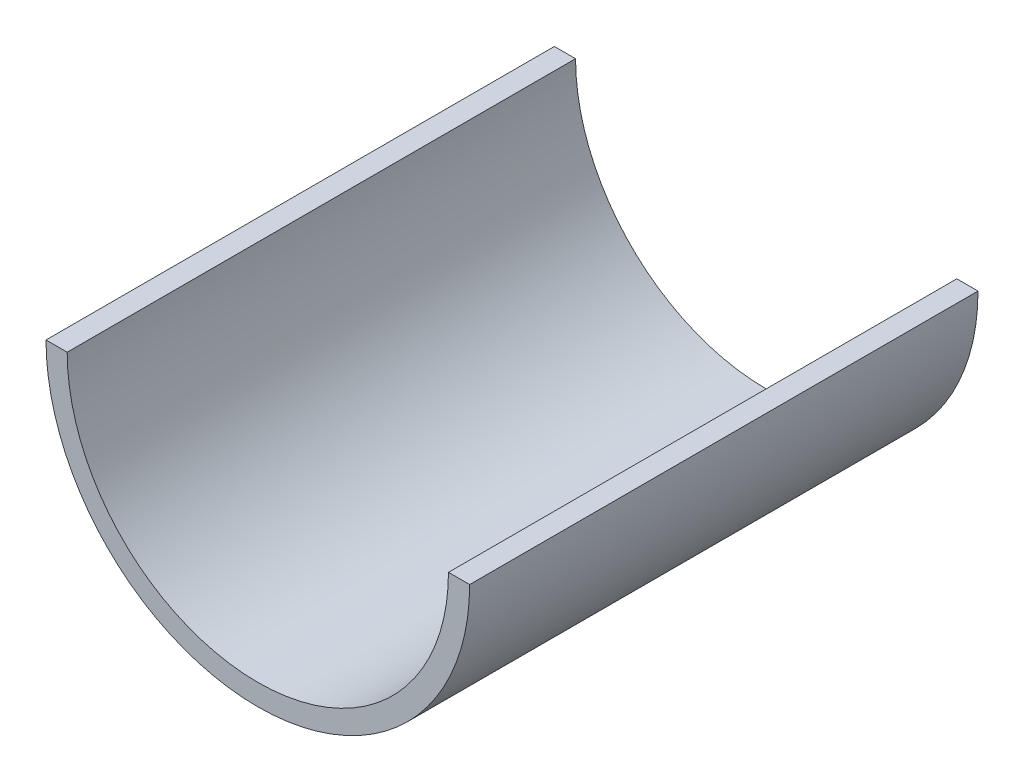
ISO-10303-21;
HEADER;
FILE_DESCRIPTION(('STEP AP214'),'2;1');
FILE_NAME('part.step','',(''),(''),'','','');
FILE_SCHEMA(('AUTOMOTIVE_DESIGN { 1 0 10303 214 1 1 1 1 }'));
ENDSEC;
DATA;
#1=APPLICATION_CONTEXT('core data for automotive mechanical design processes');
#2=APPLICATION_PROTOCOL_DEFINITION('international standard','automotive_design',2000,#1);
#3=PRODUCT_CONTEXT('',#1,'mechanical');
#4=PRODUCT('Part','Part','',(#3));
#5=PRODUCT_RELATED_PRODUCT_CATEGORY('part','',(#4));
#6=PRODUCT_DEFINITION_FORMATION('','',#4);
#7=PRODUCT_DEFINITION_CONTEXT('part definition',#1,'design');
#8=PRODUCT_DEFINITION('design','',#6,#7);
#9=PRODUCT_DEFINITION_SHAPE('','',#8);
#10=(LENGTH_UNIT() NAMED_UNIT(*) SI_UNIT(.MILLI.,.METRE.));
#11=(NAMED_UNIT(*) PLANE_ANGLE_UNIT() SI_UNIT($,.RADIAN.));
#12=(NAMED_UNIT(*) SI_UNIT($,.STERADIAN.) SOLID_ANGLE_UNIT());
#13=UNCERTAINTY_MEASURE_WITH_UNIT(LENGTH_MEASURE(1.E-05),#10,'distance_accuracy_value','');
#14=(GEOMETRIC_REPRESENTATION_CONTEXT(3) GLOBAL_UNCERTAINTY_ASSIGNED_CONTEXT((#13)) GLOBAL_UNIT_ASSIGNED_CONTEXT((#10,
#11,#12)) REPRESENTATION_CONTEXT('',''));
#15=CARTESIAN_POINT('',(0.,0.,0.));
#16=DIRECTION('',(0.,0.,1.));
#17=DIRECTION('',(1.,0.,0.));
#18=AXIS2_PLACEMENT_3D('',#15,#16,#17);
#19=CARTESIAN_POINT('',(0.,0.,152.4));
#20=DIRECTION('',(0.,0.,-1.));
#21=DIRECTION('',(-1.,0.,0.));
#22=AXIS2_PLACEMENT_3D('',#19,#20,#21);
#23=CYLINDRICAL_SURFACE('',#22,63.5);
#24=CARTESIAN_POINT('',(0.,0.,0.));
#25=DIRECTION('',(0.,0.,1.));
#26=DIRECTION('',(1.,0.,0.));
#27=AXIS2_PLACEMENT_3D('',#24,#25,#26);
#28=CIRCLE('',#27,63.5);
#29=CARTESIAN_POINT('',(-63.5,0.,0.));
#30=VERTEX_POINT('',#29);
#31=CARTESIAN_POINT('',(63.5,0.,0.));
#32=VERTEX_POINT('',#31);
#33=EDGE_CURVE('E98',#30,#32,#28,.T.);
#34=ORIENTED_EDGE('',*,*,#33,.T.);
#35=DIRECTION('',(0.,0.,-1.));
#36=VECTOR('',#35,1.);
#37=CARTESIAN_POINT('',(63.5,0.,152.4));
#38=LINE('',#37,#36);
#39=CARTESIAN_POINT('',(63.5,0.,152.4));
#40=VERTEX_POINT('',#39);
#41=EDGE_CURVE('E11',#40,#32,#38,.T.);
#42=ORIENTED_EDGE('',*,*,#41,.F.);
#43=CARTESIAN_POINT('',(0.,0.,152.4));
#44=DIRECTION('',(0.,0.,1.));
#45=DIRECTION('',(1.,0.,0.));
#46=AXIS2_PLACEMENT_3D('',#43,#44,#45);
#47=CIRCLE('',#46,63.5);
#48=CARTESIAN_POINT('',(-63.5,0.,152.4));
#49=VERTEX_POINT('',#48);
#50=EDGE_CURVE('E86',#49,#40,#47,.T.);
#51=ORIENTED_EDGE('',*,*,#50,.F.);
#52=DIRECTION('',(0.,0.,-1.));
#53=VECTOR('',#52,1.);
#54=CARTESIAN_POINT('',(-63.5,0.,152.4));
#55=LINE('',#54,#53);
#56=EDGE_CURVE('E94',#49,#30,#55,.T.);
#57=ORIENTED_EDGE('',*,*,#56,.T.);
#58=EDGE_LOOP('',(#34,#42,#51,#57));
#59=FACE_BOUND('',#58,.T.);
#60=ADVANCED_FACE('F35',(#59),#23,.T.);
#61=CARTESIAN_POINT('',(57.15,0.,152.4));
#62=DIRECTION('',(0.,-1.,0.));
#63=DIRECTION('',(0.,0.,-1.));
#64=AXIS2_PLACEMENT_3D('',#61,#62,#63);
#65=PLANE('',#64);
#66=DIRECTION('',(-1.,0.,0.));
#67=VECTOR('',#66,1.);
#68=CARTESIAN_POINT('',(57.15,0.,0.));
#69=LINE('',#68,#67);
#70=CARTESIAN_POINT('',(57.15,0.,0.));
#71=VERTEX_POINT('',#70);
#72=EDGE_CURVE('E90',#32,#71,#69,.T.);
#73=ORIENTED_EDGE('',*,*,#72,.T.);
#74=DIRECTION('',(0.,0.,-1.));
#75=VECTOR('',#74,1.);
#76=CARTESIAN_POINT('',(57.15,0.,152.4));
#77=LINE('',#76,#75);
#78=CARTESIAN_POINT('',(57.15,0.,152.4));
#79=VERTEX_POINT('',#78);
#80=EDGE_CURVE('E43',#79,#71,#77,.T.);
#81=ORIENTED_EDGE('',*,*,#80,.F.);
#82=DIRECTION('',(-1.,0.,0.));
#83=VECTOR('',#82,1.);
#84=CARTESIAN_POINT('',(57.15,0.,152.4));
#85=LINE('',#84,#83);
#86=EDGE_CURVE('E81',#40,#79,#85,.T.);
#87=ORIENTED_EDGE('',*,*,#86,.F.);
#88=ORIENTED_EDGE('',*,*,#41,.T.);
#89=EDGE_LOOP('',(#73,#81,#87,#88));
#90=FACE_BOUND('',#89,.T.);
#91=ADVANCED_FACE('F89',(#90),#65,.F.);
#92=CARTESIAN_POINT('',(0.,0.,152.4));
#93=DIRECTION('',(0.,0.,-1.));
#94=DIRECTION('',(-1.,0.,0.));
#95=AXIS2_PLACEMENT_3D('',#92,#93,#94);
#96=CYLINDRICAL_SURFACE('',#95,57.15);
#97=CARTESIAN_POINT('',(0.,0.,0.));
#98=DIRECTION('',(0.,0.,-1.));
#99=DIRECTION('',(1.,0.,0.));
#100=AXIS2_PLACEMENT_3D('',#97,#98,#99);
#101=CIRCLE('',#100,57.15);
#102=CARTESIAN_POINT('',(-57.15,0.,0.));
#103=VERTEX_POINT('',#102);
#104=EDGE_CURVE('E68',#71,#103,#101,.T.);
#105=ORIENTED_EDGE('',*,*,#104,.T.);
#106=DIRECTION('',(0.,0.,-1.));
#107=VECTOR('',#106,1.);
#108=CARTESIAN_POINT('',(-57.15,0.,152.4));
#109=LINE('',#108,#107);
#110=CARTESIAN_POINT('',(-57.15,0.,152.4));
#111=VERTEX_POINT('',#110);
#112=EDGE_CURVE('E91',#111,#103,#109,.T.);
#113=ORIENTED_EDGE('',*,*,#112,.F.);
#114=CARTESIAN_POINT('',(0.,0.,152.4));
#115=DIRECTION('',(0.,0.,-1.));
#116=DIRECTION('',(1.,0.,0.));
#117=AXIS2_PLACEMENT_3D('',#114,#115,#116);
#118=CIRCLE('',#117,57.15);
#119=EDGE_CURVE('E84',#79,#111,#118,.T.);
#120=ORIENTED_EDGE('',*,*,#119,.F.);
#121=ORIENTED_EDGE('',*,*,#80,.T.);
#122=EDGE_LOOP('',(#105,#113,#120,#121));
#123=FACE_BOUND('',#122,.T.);
#124=ADVANCED_FACE('F92',(#123),#96,.F.);
#125=CARTESIAN_POINT('',(-63.5,0.,152.4));
#126=DIRECTION('',(0.,-1.,0.));
#127=DIRECTION('',(0.,0.,-1.));
#128=AXIS2_PLACEMENT_3D('',#125,#126,#127);
#129=PLANE('',#128);
#130=DIRECTION('',(-1.,0.,0.));
#131=VECTOR('',#130,1.);
#132=CARTESIAN_POINT('',(-63.5,0.,0.));
#133=LINE('',#132,#131);
#134=EDGE_CURVE('E74',#103,#30,#133,.T.);
#135=ORIENTED_EDGE('',*,*,#134,.T.);
#136=ORIENTED_EDGE('',*,*,#56,.F.);
#137=DIRECTION('',(-1.,0.,0.));
#138=VECTOR('',#137,1.);
#139=CARTESIAN_POINT('',(-63.5,0.,152.4));
#140=LINE('',#139,#138);
#141=EDGE_CURVE('E51',#111,#49,#140,.T.);
#142=ORIENTED_EDGE('',*,*,#141,.F.);
#143=ORIENTED_EDGE('',*,*,#112,.T.);
#144=EDGE_LOOP('',(#135,#136,#142,#143));
#145=FACE_BOUND('',#144,.T.);
#146=ADVANCED_FACE('F105',(#145),#129,.F.);
#147=CARTESIAN_POINT('',(0.,0.,152.4));
#148=DIRECTION('',(0.,0.,1.));
#149=DIRECTION('',(1.,0.,0.));
#150=AXIS2_PLACEMENT_3D('',#147,#148,#149);
#151=PLANE('',#150);
#152=ORIENTED_EDGE('',*,*,#50,.T.);
#153=ORIENTED_EDGE('',*,*,#86,.T.);
#154=ORIENTED_EDGE('',*,*,#119,.T.);
#155=ORIENTED_EDGE('',*,*,#141,.T.);
#156=EDGE_LOOP('',(#152,#153,#154,#155));
#157=FACE_BOUND('',#156,.T.);
#158=ADVANCED_FACE('F82',(#157),#151,.T.);
#159=CARTESIAN_POINT('',(0.,0.,0.));
#160=DIRECTION('',(0.,0.,1.));
#161=DIRECTION('',(1.,0.,0.));
#162=AXIS2_PLACEMENT_3D('',#159,#160,#161);
#163=PLANE('',#162);
#164=ORIENTED_EDGE('',*,*,#33,.F.);
#165=ORIENTED_EDGE('',*,*,#134,.F.);
#166=ORIENTED_EDGE('',*,*,#104,.F.);
#167=ORIENTED_EDGE('',*,*,#72,.F.);
#168=EDGE_LOOP('',(#164,#165,#166,#167));
#169=FACE_BOUND('',#168,.T.);
#170=ADVANCED_FACE('F108',(#169),#163,.F.);
#171=CLOSED_SHELL('',(#60,#91,#124,#146,#158,#170));
#172=MANIFOLD_SOLID_BREP('B2',#171);
#173=ADVANCED_BREP_SHAPE_REPRESENTATION('',(#18,#172),#14);
#174=SHAPE_DEFINITION_REPRESENTATION(#9,#173);
ENDSEC;
END-ISO-10303-21;
